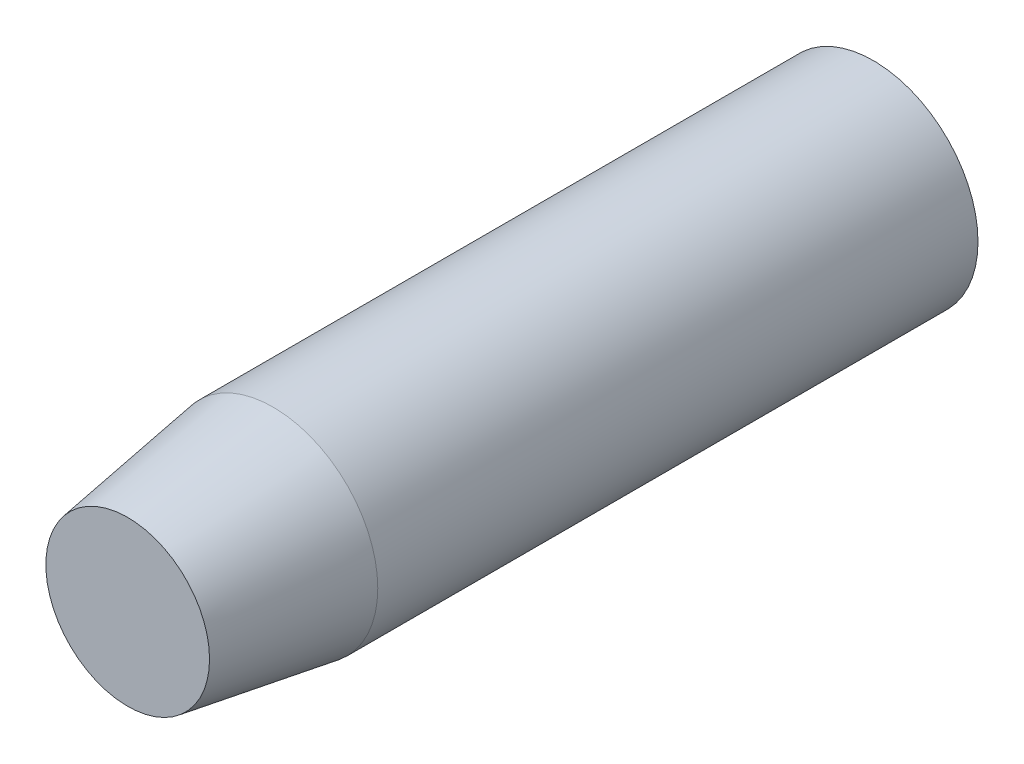
ISO-10303-21;
HEADER;
FILE_DESCRIPTION(('STEP AP214'),'2;1');
FILE_NAME('part.step','',(''),(''),'','','');
FILE_SCHEMA(('AUTOMOTIVE_DESIGN { 1 0 10303 214 1 1 1 1 }'));
ENDSEC;
DATA;
#1=APPLICATION_CONTEXT('core data for automotive mechanical design processes');
#2=APPLICATION_PROTOCOL_DEFINITION('international standard','automotive_design',2000,#1);
#3=PRODUCT_CONTEXT('',#1,'mechanical');
#4=PRODUCT('Part','Part','',(#3));
#5=PRODUCT_RELATED_PRODUCT_CATEGORY('part','',(#4));
#6=PRODUCT_DEFINITION_FORMATION('','',#4);
#7=PRODUCT_DEFINITION_CONTEXT('part definition',#1,'design');
#8=PRODUCT_DEFINITION('design','',#6,#7);
#9=PRODUCT_DEFINITION_SHAPE('','',#8);
#10=(LENGTH_UNIT() NAMED_UNIT(*) SI_UNIT(.MILLI.,.METRE.));
#11=(NAMED_UNIT(*) PLANE_ANGLE_UNIT() SI_UNIT($,.RADIAN.));
#12=(NAMED_UNIT(*) SI_UNIT($,.STERADIAN.) SOLID_ANGLE_UNIT());
#13=UNCERTAINTY_MEASURE_WITH_UNIT(LENGTH_MEASURE(1.E-05),#10,'distance_accuracy_value','');
#14=(GEOMETRIC_REPRESENTATION_CONTEXT(3) GLOBAL_UNCERTAINTY_ASSIGNED_CONTEXT((#13)) GLOBAL_UNIT_ASSIGNED_CONTEXT((#10,
#11,#12)) REPRESENTATION_CONTEXT('',''));
#15=CARTESIAN_POINT('',(0.,0.,0.));
#16=DIRECTION('',(0.,0.,1.));
#17=DIRECTION('',(1.,0.,0.));
#18=AXIS2_PLACEMENT_3D('',#15,#16,#17);
#19=CARTESIAN_POINT('',(0.,0.,65.0875));
#20=DIRECTION('',(0.,0.,-1.));
#21=DIRECTION('',(-1.,0.,0.));
#22=AXIS2_PLACEMENT_3D('',#19,#20,#21);
#23=CYLINDRICAL_SURFACE('',#22,18.25625);
#24=CARTESIAN_POINT('',(0.,0.,39.6874999999998));
#25=DIRECTION('',(0.,0.,1.));
#26=DIRECTION('',(1.,0.,0.));
#27=AXIS2_PLACEMENT_3D('',#24,#25,#26);
#28=CIRCLE('',#27,18.25625);
#29=CARTESIAN_POINT('',(18.25625,0.,39.6874999999998));
#30=VERTEX_POINT('',#29);
#31=EDGE_CURVE('E10',#30,#30,#28,.F.);
#32=ORIENTED_EDGE('',*,*,#31,.T.);
#33=EDGE_LOOP('',(#32));
#34=FACE_BOUND('',#33,.T.);
#35=CARTESIAN_POINT('',(0.,0.,-65.0875));
#36=DIRECTION('',(0.,0.,1.));
#37=DIRECTION('',(1.,0.,0.));
#38=AXIS2_PLACEMENT_3D('',#35,#36,#37);
#39=CIRCLE('',#38,18.25625);
#40=CARTESIAN_POINT('',(18.25625,0.,-65.0875));
#41=VERTEX_POINT('',#40);
#42=EDGE_CURVE('E50',#41,#41,#39,.T.);
#43=ORIENTED_EDGE('',*,*,#42,.T.);
#44=EDGE_LOOP('',(#43));
#45=FACE_BOUND('',#44,.T.);
#46=ADVANCED_FACE('F39',(#34,#45),#23,.T.);
#47=CARTESIAN_POINT('',(0.,0.,65.0875));
#48=DIRECTION('',(0.,0.,1.));
#49=DIRECTION('',(1.,0.,0.));
#50=AXIS2_PLACEMENT_3D('',#47,#48,#49);
#51=PLANE('',#50);
#52=CARTESIAN_POINT('',(0.,0.,65.0875));
#53=DIRECTION('',(0.,0.,1.));
#54=DIRECTION('',(1.,0.,0.));
#55=AXIS2_PLACEMENT_3D('',#52,#53,#54);
#56=CIRCLE('',#55,14.2875000000001);
#57=CARTESIAN_POINT('',(14.2875000000001,0.,65.0875));
#58=VERTEX_POINT('',#57);
#59=EDGE_CURVE('E46',#58,#58,#56,.T.);
#60=ORIENTED_EDGE('',*,*,#59,.T.);
#61=EDGE_LOOP('',(#60));
#62=FACE_BOUND('',#61,.T.);
#63=ADVANCED_FACE('F60',(#62),#51,.T.);
#64=CARTESIAN_POINT('',(0.,0.,-65.0875));
#65=DIRECTION('',(0.,0.,1.));
#66=DIRECTION('',(1.,0.,0.));
#67=AXIS2_PLACEMENT_3D('',#64,#65,#66);
#68=PLANE('',#67);
#69=ORIENTED_EDGE('',*,*,#42,.F.);
#70=EDGE_LOOP('',(#69));
#71=FACE_BOUND('',#70,.T.);
#72=ADVANCED_FACE('F58',(#71),#68,.F.);
#73=CARTESIAN_POINT('',(0.,0.,65.0875));
#74=DIRECTION('',(0.,0.,-1.));
#75=DIRECTION('',(-1.,0.,0.));
#76=AXIS2_PLACEMENT_3D('',#73,#74,#75);
#77=CONICAL_SURFACE('',#76,14.2875000000001,0.154996741923938);
#78=ORIENTED_EDGE('',*,*,#31,.F.);
#79=EDGE_LOOP('',(#78));
#80=FACE_BOUND('',#79,.T.);
#81=ORIENTED_EDGE('',*,*,#59,.F.);
#82=EDGE_LOOP('',(#81));
#83=FACE_BOUND('',#82,.T.);
#84=ADVANCED_FACE('F41',(#80,#83),#77,.T.);
#85=CLOSED_SHELL('',(#46,#63,#72,#84));
#86=MANIFOLD_SOLID_BREP('B2',#85);
#87=ADVANCED_BREP_SHAPE_REPRESENTATION('',(#18,#86),#14);
#88=SHAPE_DEFINITION_REPRESENTATION(#9,#87);
ENDSEC;
END-ISO-10303-21;
